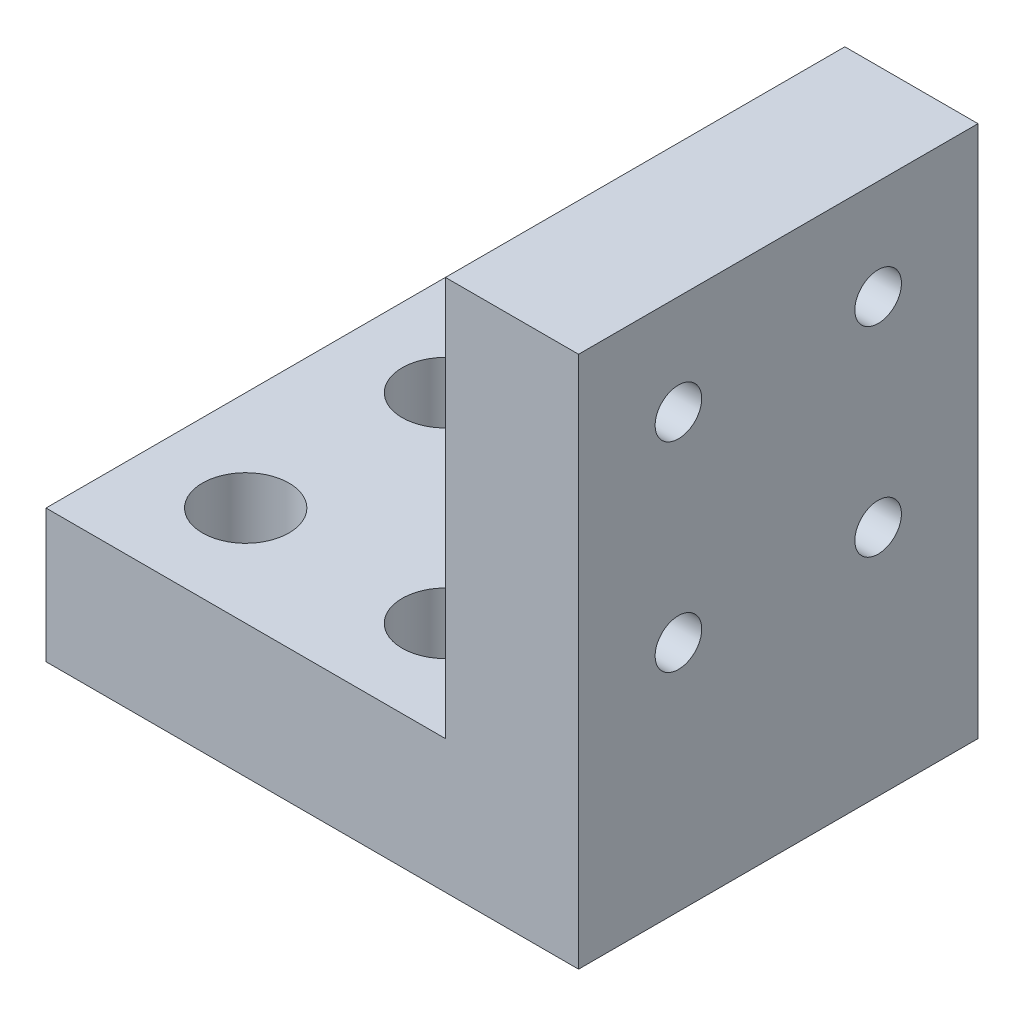
ISO-10303-21;
HEADER;
FILE_DESCRIPTION(('STEP AP214'),'2;1');
FILE_NAME('part.step','',(''),(''),'','','');
FILE_SCHEMA(('AUTOMOTIVE_DESIGN { 1 0 10303 214 1 1 1 1 }'));
ENDSEC;
DATA;
#1=APPLICATION_CONTEXT('core data for automotive mechanical design processes');
#2=APPLICATION_PROTOCOL_DEFINITION('international standard','automotive_design',2000,#1);
#3=PRODUCT_CONTEXT('',#1,'mechanical');
#4=PRODUCT('Part','Part','',(#3));
#5=PRODUCT_RELATED_PRODUCT_CATEGORY('part','',(#4));
#6=PRODUCT_DEFINITION_FORMATION('','',#4);
#7=PRODUCT_DEFINITION_CONTEXT('part definition',#1,'design');
#8=PRODUCT_DEFINITION('design','',#6,#7);
#9=PRODUCT_DEFINITION_SHAPE('','',#8);
#10=(LENGTH_UNIT() NAMED_UNIT(*) SI_UNIT(.MILLI.,.METRE.));
#11=(NAMED_UNIT(*) PLANE_ANGLE_UNIT() SI_UNIT($,.RADIAN.));
#12=(NAMED_UNIT(*) SI_UNIT($,.STERADIAN.) SOLID_ANGLE_UNIT());
#13=UNCERTAINTY_MEASURE_WITH_UNIT(LENGTH_MEASURE(1.E-05),#10,'distance_accuracy_value','');
#14=(GEOMETRIC_REPRESENTATION_CONTEXT(3) GLOBAL_UNCERTAINTY_ASSIGNED_CONTEXT((#13)) GLOBAL_UNIT_ASSIGNED_CONTEXT((#10,
#11,#12)) REPRESENTATION_CONTEXT('',''));
#15=CARTESIAN_POINT('',(0.,0.,0.));
#16=DIRECTION('',(0.,0.,1.));
#17=DIRECTION('',(1.,0.,0.));
#18=AXIS2_PLACEMENT_3D('',#15,#16,#17);
#19=CARTESIAN_POINT('',(0.,10.,0.));
#20=DIRECTION('',(0.,-1.,0.));
#21=DIRECTION('',(0.,0.,-1.));
#22=AXIS2_PLACEMENT_3D('',#19,#20,#21);
#23=PLANE('',#22);
#24=CARTESIAN_POINT('',(7.50000000000016,10.,-7.5));
#25=DIRECTION('',(0.,1.,0.));
#26=DIRECTION('',(0.,0.,1.));
#27=AXIS2_PLACEMENT_3D('',#24,#25,#26);
#28=CIRCLE('',#27,3.25);
#29=CARTESIAN_POINT('',(7.50000000000016,10.,-4.25));
#30=VERTEX_POINT('',#29);
#31=EDGE_CURVE('E141',#30,#30,#28,.T.);
#32=ORIENTED_EDGE('',*,*,#31,.F.);
#33=EDGE_LOOP('',(#32));
#34=FACE_BOUND('',#33,.T.);
#35=CARTESIAN_POINT('',(22.5000000000002,10.,-7.5));
#36=DIRECTION('',(0.,1.,0.));
#37=DIRECTION('',(0.,0.,1.));
#38=AXIS2_PLACEMENT_3D('',#35,#36,#37);
#39=CIRCLE('',#38,3.25);
#40=CARTESIAN_POINT('',(22.5000000000002,10.,-4.25));
#41=VERTEX_POINT('',#40);
#42=EDGE_CURVE('E209',#41,#41,#39,.T.);
#43=ORIENTED_EDGE('',*,*,#42,.F.);
#44=EDGE_LOOP('',(#43));
#45=FACE_BOUND('',#44,.T.);
#46=CARTESIAN_POINT('',(22.5,10.,-22.5));
#47=DIRECTION('',(0.,1.,0.));
#48=DIRECTION('',(0.,0.,1.));
#49=AXIS2_PLACEMENT_3D('',#46,#47,#48);
#50=CIRCLE('',#49,3.25);
#51=CARTESIAN_POINT('',(22.5,10.,-19.25));
#52=VERTEX_POINT('',#51);
#53=EDGE_CURVE('E201',#52,#52,#50,.T.);
#54=ORIENTED_EDGE('',*,*,#53,.F.);
#55=EDGE_LOOP('',(#54));
#56=FACE_BOUND('',#55,.T.);
#57=CARTESIAN_POINT('',(7.5,10.,-22.5));
#58=DIRECTION('',(0.,1.,0.));
#59=DIRECTION('',(0.,0.,1.));
#60=AXIS2_PLACEMENT_3D('',#57,#58,#59);
#61=CIRCLE('',#60,3.25);
#62=CARTESIAN_POINT('',(7.5,10.,-19.25));
#63=VERTEX_POINT('',#62);
#64=EDGE_CURVE('E200',#63,#63,#61,.T.);
#65=ORIENTED_EDGE('',*,*,#64,.F.);
#66=EDGE_LOOP('',(#65));
#67=FACE_BOUND('',#66,.T.);
#68=DIRECTION('',(0.,0.,1.));
#69=VECTOR('',#68,1.);
#70=CARTESIAN_POINT('',(30.,10.,-30.));
#71=LINE('',#70,#69);
#72=CARTESIAN_POINT('',(30.,10.,-30.));
#73=VERTEX_POINT('',#72);
#74=CARTESIAN_POINT('',(30.,10.,0.));
#75=VERTEX_POINT('',#74);
#76=EDGE_CURVE('E57',#73,#75,#71,.T.);
#77=ORIENTED_EDGE('',*,*,#76,.F.);
#78=DIRECTION('',(-1.,0.,0.));
#79=VECTOR('',#78,1.);
#80=CARTESIAN_POINT('',(0.,10.,-30.));
#81=LINE('',#80,#79);
#82=CARTESIAN_POINT('',(0.,10.,-30.));
#83=VERTEX_POINT('',#82);
#84=EDGE_CURVE('E62',#73,#83,#81,.T.);
#85=ORIENTED_EDGE('',*,*,#84,.T.);
#86=DIRECTION('',(0.,0.,1.));
#87=VECTOR('',#86,1.);
#88=CARTESIAN_POINT('',(0.,10.,0.));
#89=LINE('',#88,#87);
#90=CARTESIAN_POINT('',(0.,10.,0.));
#91=VERTEX_POINT('',#90);
#92=EDGE_CURVE('E94',#83,#91,#89,.T.);
#93=ORIENTED_EDGE('',*,*,#92,.T.);
#94=DIRECTION('',(1.,0.,0.));
#95=VECTOR('',#94,1.);
#96=CARTESIAN_POINT('',(0.,10.,0.));
#97=LINE('',#96,#95);
#98=EDGE_CURVE('E249',#91,#75,#97,.T.);
#99=ORIENTED_EDGE('',*,*,#98,.T.);
#100=EDGE_LOOP('',(#77,#85,#93,#99));
#101=FACE_BOUND('',#100,.T.);
#102=ADVANCED_FACE('F39',(#34,#45,#56,#67,#101),#23,.F.);
#103=CARTESIAN_POINT('',(0.,10.,0.));
#104=DIRECTION('',(1.,0.,0.));
#105=DIRECTION('',(0.,0.,-1.));
#106=AXIS2_PLACEMENT_3D('',#103,#104,#105);
#107=PLANE('',#106);
#108=DIRECTION('',(0.,0.,1.));
#109=VECTOR('',#108,1.);
#110=CARTESIAN_POINT('',(0.,0.,0.));
#111=LINE('',#110,#109);
#112=CARTESIAN_POINT('',(0.,0.,-30.));
#113=VERTEX_POINT('',#112);
#114=CARTESIAN_POINT('',(0.,0.,0.));
#115=VERTEX_POINT('',#114);
#116=EDGE_CURVE('E100',#113,#115,#111,.T.);
#117=ORIENTED_EDGE('',*,*,#116,.T.);
#118=DIRECTION('',(0.,-1.,0.));
#119=VECTOR('',#118,1.);
#120=CARTESIAN_POINT('',(0.,10.,0.));
#121=LINE('',#120,#119);
#122=EDGE_CURVE('E11',#91,#115,#121,.T.);
#123=ORIENTED_EDGE('',*,*,#122,.F.);
#124=ORIENTED_EDGE('',*,*,#92,.F.);
#125=DIRECTION('',(0.,-1.,0.));
#126=VECTOR('',#125,1.);
#127=CARTESIAN_POINT('',(0.,10.,-30.));
#128=LINE('',#127,#126);
#129=EDGE_CURVE('E85',#83,#113,#128,.T.);
#130=ORIENTED_EDGE('',*,*,#129,.T.);
#131=EDGE_LOOP('',(#117,#123,#124,#130));
#132=FACE_BOUND('',#131,.T.);
#133=ADVANCED_FACE('F41',(#132),#107,.F.);
#134=CARTESIAN_POINT('',(0.,10.,0.));
#135=DIRECTION('',(0.,0.,-1.));
#136=DIRECTION('',(-1.,0.,0.));
#137=AXIS2_PLACEMENT_3D('',#134,#135,#136);
#138=PLANE('',#137);
#139=DIRECTION('',(1.,0.,0.));
#140=VECTOR('',#139,1.);
#141=CARTESIAN_POINT('',(0.,0.,0.));
#142=LINE('',#141,#140);
#143=CARTESIAN_POINT('',(40.,0.,0.));
#144=VERTEX_POINT('',#143);
#145=EDGE_CURVE('E104',#115,#144,#142,.T.);
#146=ORIENTED_EDGE('',*,*,#145,.T.);
#147=DIRECTION('',(0.,-1.,0.));
#148=VECTOR('',#147,1.);
#149=CARTESIAN_POINT('',(40.,10.,0.));
#150=LINE('',#149,#148);
#151=CARTESIAN_POINT('',(40.,40.,0.));
#152=VERTEX_POINT('',#151);
#153=EDGE_CURVE('E49',#152,#144,#150,.T.);
#154=ORIENTED_EDGE('',*,*,#153,.F.);
#155=DIRECTION('',(1.,0.,0.));
#156=VECTOR('',#155,1.);
#157=CARTESIAN_POINT('',(40.,40.,0.));
#158=LINE('',#157,#156);
#159=CARTESIAN_POINT('',(30.,40.,0.));
#160=VERTEX_POINT('',#159);
#161=EDGE_CURVE('E239',#160,#152,#158,.T.);
#162=ORIENTED_EDGE('',*,*,#161,.F.);
#163=DIRECTION('',(0.,-1.,0.));
#164=VECTOR('',#163,1.);
#165=CARTESIAN_POINT('',(30.,40.,0.));
#166=LINE('',#165,#164);
#167=EDGE_CURVE('E112',#160,#75,#166,.T.);
#168=ORIENTED_EDGE('',*,*,#167,.T.);
#169=ORIENTED_EDGE('',*,*,#98,.F.);
#170=ORIENTED_EDGE('',*,*,#122,.T.);
#171=EDGE_LOOP('',(#146,#154,#162,#168,#169,#170));
#172=FACE_BOUND('',#171,.T.);
#173=ADVANCED_FACE('F262',(#172),#138,.F.);
#174=CARTESIAN_POINT('',(40.,10.,0.));
#175=DIRECTION('',(-1.,0.,0.));
#176=DIRECTION('',(0.,0.,1.));
#177=AXIS2_PLACEMENT_3D('',#174,#175,#176);
#178=PLANE('',#177);
#179=CARTESIAN_POINT('',(40.,17.4999999999999,-22.4999999999998));
#180=DIRECTION('',(-1.,0.,0.));
#181=DIRECTION('',(0.,0.,1.));
#182=AXIS2_PLACEMENT_3D('',#179,#180,#181);
#183=CIRCLE('',#182,1.75);
#184=CARTESIAN_POINT('',(40.,17.4999999999999,-20.7499999999998));
#185=VERTEX_POINT('',#184);
#186=EDGE_CURVE('E559',#185,#185,#183,.F.);
#187=ORIENTED_EDGE('',*,*,#186,.F.);
#188=EDGE_LOOP('',(#187));
#189=FACE_BOUND('',#188,.T.);
#190=CARTESIAN_POINT('',(40.,17.4999999999999,-7.49999999999984));
#191=DIRECTION('',(-1.,0.,0.));
#192=DIRECTION('',(0.,0.,1.));
#193=AXIS2_PLACEMENT_3D('',#190,#191,#192);
#194=CIRCLE('',#193,1.75);
#195=CARTESIAN_POINT('',(40.,17.4999999999999,-5.74999999999984));
#196=VERTEX_POINT('',#195);
#197=EDGE_CURVE('E552',#196,#196,#194,.F.);
#198=ORIENTED_EDGE('',*,*,#197,.F.);
#199=EDGE_LOOP('',(#198));
#200=FACE_BOUND('',#199,.T.);
#201=CARTESIAN_POINT('',(40.,32.4999999999999,-7.5));
#202=DIRECTION('',(-1.,0.,0.));
#203=DIRECTION('',(0.,0.,1.));
#204=AXIS2_PLACEMENT_3D('',#201,#202,#203);
#205=CIRCLE('',#204,1.75);
#206=CARTESIAN_POINT('',(40.,32.4999999999999,-5.75));
#207=VERTEX_POINT('',#206);
#208=EDGE_CURVE('E549',#207,#207,#205,.F.);
#209=ORIENTED_EDGE('',*,*,#208,.F.);
#210=EDGE_LOOP('',(#209));
#211=FACE_BOUND('',#210,.T.);
#212=CARTESIAN_POINT('',(40.,32.4999999999999,-22.5));
#213=DIRECTION('',(-1.,0.,0.));
#214=DIRECTION('',(0.,0.,1.));
#215=AXIS2_PLACEMENT_3D('',#212,#213,#214);
#216=CIRCLE('',#215,1.75);
#217=CARTESIAN_POINT('',(40.,32.4999999999999,-20.75));
#218=VERTEX_POINT('',#217);
#219=EDGE_CURVE('E147',#218,#218,#216,.F.);
#220=ORIENTED_EDGE('',*,*,#219,.F.);
#221=EDGE_LOOP('',(#220));
#222=FACE_BOUND('',#221,.T.);
#223=DIRECTION('',(0.,0.,-1.));
#224=VECTOR('',#223,1.);
#225=CARTESIAN_POINT('',(40.,0.,0.));
#226=LINE('',#225,#224);
#227=CARTESIAN_POINT('',(40.,0.,-30.));
#228=VERTEX_POINT('',#227);
#229=EDGE_CURVE('E95',#144,#228,#226,.T.);
#230=ORIENTED_EDGE('',*,*,#229,.T.);
#231=DIRECTION('',(0.,-1.,0.));
#232=VECTOR('',#231,1.);
#233=CARTESIAN_POINT('',(40.,10.,-30.));
#234=LINE('',#233,#232);
#235=CARTESIAN_POINT('',(40.,40.,-30.));
#236=VERTEX_POINT('',#235);
#237=EDGE_CURVE('E89',#236,#228,#234,.T.);
#238=ORIENTED_EDGE('',*,*,#237,.F.);
#239=DIRECTION('',(0.,0.,-1.));
#240=VECTOR('',#239,1.);
#241=CARTESIAN_POINT('',(40.,40.,-30.));
#242=LINE('',#241,#240);
#243=EDGE_CURVE('E227',#152,#236,#242,.T.);
#244=ORIENTED_EDGE('',*,*,#243,.F.);
#245=ORIENTED_EDGE('',*,*,#153,.T.);
#246=EDGE_LOOP('',(#230,#238,#244,#245));
#247=FACE_BOUND('',#246,.T.);
#248=ADVANCED_FACE('F271',(#189,#200,#211,#222,#247),#178,.F.);
#249=CARTESIAN_POINT('',(0.,10.,-30.));
#250=DIRECTION('',(0.,0.,1.));
#251=DIRECTION('',(1.,0.,0.));
#252=AXIS2_PLACEMENT_3D('',#249,#250,#251);
#253=PLANE('',#252);
#254=DIRECTION('',(-1.,0.,0.));
#255=VECTOR('',#254,1.);
#256=CARTESIAN_POINT('',(0.,0.,-30.));
#257=LINE('',#256,#255);
#258=EDGE_CURVE('E82',#228,#113,#257,.T.);
#259=ORIENTED_EDGE('',*,*,#258,.T.);
#260=ORIENTED_EDGE('',*,*,#129,.F.);
#261=ORIENTED_EDGE('',*,*,#84,.F.);
#262=DIRECTION('',(0.,-1.,0.));
#263=VECTOR('',#262,1.);
#264=CARTESIAN_POINT('',(30.,40.,-30.));
#265=LINE('',#264,#263);
#266=CARTESIAN_POINT('',(30.,40.,-30.));
#267=VERTEX_POINT('',#266);
#268=EDGE_CURVE('E106',#267,#73,#265,.T.);
#269=ORIENTED_EDGE('',*,*,#268,.F.);
#270=DIRECTION('',(-1.,0.,0.));
#271=VECTOR('',#270,1.);
#272=CARTESIAN_POINT('',(40.,40.,-30.));
#273=LINE('',#272,#271);
#274=EDGE_CURVE('E231',#236,#267,#273,.T.);
#275=ORIENTED_EDGE('',*,*,#274,.F.);
#276=ORIENTED_EDGE('',*,*,#237,.T.);
#277=EDGE_LOOP('',(#259,#260,#261,#269,#275,#276));
#278=FACE_BOUND('',#277,.T.);
#279=ADVANCED_FACE('F84',(#278),#253,.F.);
#280=CARTESIAN_POINT('',(0.,0.,0.));
#281=DIRECTION('',(0.,-1.,0.));
#282=DIRECTION('',(0.,0.,-1.));
#283=AXIS2_PLACEMENT_3D('',#280,#281,#282);
#284=PLANE('',#283);
#285=CARTESIAN_POINT('',(7.50000000000016,0.,-7.5));
#286=DIRECTION('',(0.,-1.,0.));
#287=DIRECTION('',(0.,0.,-1.));
#288=AXIS2_PLACEMENT_3D('',#285,#286,#287);
#289=CIRCLE('',#288,1.75);
#290=CARTESIAN_POINT('',(7.50000000000016,0.,-9.25));
#291=VERTEX_POINT('',#290);
#292=EDGE_CURVE('E176',#291,#291,#289,.F.);
#293=ORIENTED_EDGE('',*,*,#292,.T.);
#294=EDGE_LOOP('',(#293));
#295=FACE_BOUND('',#294,.T.);
#296=CARTESIAN_POINT('',(22.5000000000002,0.,-7.5));
#297=DIRECTION('',(0.,-1.,0.));
#298=DIRECTION('',(0.,0.,-1.));
#299=AXIS2_PLACEMENT_3D('',#296,#297,#298);
#300=CIRCLE('',#299,1.75);
#301=CARTESIAN_POINT('',(22.5000000000002,0.,-9.25));
#302=VERTEX_POINT('',#301);
#303=EDGE_CURVE('E186',#302,#302,#300,.F.);
#304=ORIENTED_EDGE('',*,*,#303,.T.);
#305=EDGE_LOOP('',(#304));
#306=FACE_BOUND('',#305,.T.);
#307=CARTESIAN_POINT('',(22.5,0.,-22.5));
#308=DIRECTION('',(0.,-1.,0.));
#309=DIRECTION('',(0.,0.,-1.));
#310=AXIS2_PLACEMENT_3D('',#307,#308,#309);
#311=CIRCLE('',#310,1.75);
#312=CARTESIAN_POINT('',(22.5,0.,-24.25));
#313=VERTEX_POINT('',#312);
#314=EDGE_CURVE('E182',#313,#313,#311,.F.);
#315=ORIENTED_EDGE('',*,*,#314,.T.);
#316=EDGE_LOOP('',(#315));
#317=FACE_BOUND('',#316,.T.);
#318=CARTESIAN_POINT('',(7.5,0.,-22.5));
#319=DIRECTION('',(0.,-1.,0.));
#320=DIRECTION('',(0.,0.,-1.));
#321=AXIS2_PLACEMENT_3D('',#318,#319,#320);
#322=CIRCLE('',#321,1.75);
#323=CARTESIAN_POINT('',(7.5,0.,-24.25));
#324=VERTEX_POINT('',#323);
#325=EDGE_CURVE('E129',#324,#324,#322,.F.);
#326=ORIENTED_EDGE('',*,*,#325,.T.);
#327=EDGE_LOOP('',(#326));
#328=FACE_BOUND('',#327,.T.);
#329=ORIENTED_EDGE('',*,*,#116,.F.);
#330=ORIENTED_EDGE('',*,*,#258,.F.);
#331=ORIENTED_EDGE('',*,*,#229,.F.);
#332=ORIENTED_EDGE('',*,*,#145,.F.);
#333=EDGE_LOOP('',(#329,#330,#331,#332));
#334=FACE_BOUND('',#333,.T.);
#335=ADVANCED_FACE('F103',(#295,#306,#317,#328,#334),#284,.T.);
#336=CARTESIAN_POINT('',(30.,40.,-30.));
#337=DIRECTION('',(1.,0.,0.));
#338=DIRECTION('',(0.,0.,-1.));
#339=AXIS2_PLACEMENT_3D('',#336,#337,#338);
#340=PLANE('',#339);
#341=CARTESIAN_POINT('',(30.,17.5,-7.49999999999984));
#342=DIRECTION('',(-1.,0.,0.));
#343=DIRECTION('',(0.,0.,1.));
#344=AXIS2_PLACEMENT_3D('',#341,#342,#343);
#345=CIRCLE('',#344,3.25);
#346=CARTESIAN_POINT('',(30.,17.5,-4.24999999999984));
#347=VERTEX_POINT('',#346);
#348=EDGE_CURVE('E157',#347,#347,#345,.T.);
#349=ORIENTED_EDGE('',*,*,#348,.F.);
#350=EDGE_LOOP('',(#349));
#351=FACE_BOUND('',#350,.T.);
#352=CARTESIAN_POINT('',(30.,17.4999999999999,-22.4999999999998));
#353=DIRECTION('',(-1.,0.,0.));
#354=DIRECTION('',(0.,0.,1.));
#355=AXIS2_PLACEMENT_3D('',#352,#353,#354);
#356=CIRCLE('',#355,3.25);
#357=CARTESIAN_POINT('',(30.,17.4999999999999,-19.2499999999998));
#358=VERTEX_POINT('',#357);
#359=EDGE_CURVE('E168',#358,#358,#356,.T.);
#360=ORIENTED_EDGE('',*,*,#359,.F.);
#361=EDGE_LOOP('',(#360));
#362=FACE_BOUND('',#361,.T.);
#363=CARTESIAN_POINT('',(30.,32.4999999999999,-22.5));
#364=DIRECTION('',(-1.,0.,0.));
#365=DIRECTION('',(0.,0.,1.));
#366=AXIS2_PLACEMENT_3D('',#363,#364,#365);
#367=CIRCLE('',#366,3.25);
#368=CARTESIAN_POINT('',(30.,32.4999999999999,-19.25));
#369=VERTEX_POINT('',#368);
#370=EDGE_CURVE('E568',#369,#369,#367,.T.);
#371=ORIENTED_EDGE('',*,*,#370,.F.);
#372=EDGE_LOOP('',(#371));
#373=FACE_BOUND('',#372,.T.);
#374=CARTESIAN_POINT('',(30.,32.5,-7.5));
#375=DIRECTION('',(-1.,0.,0.));
#376=DIRECTION('',(0.,0.,1.));
#377=AXIS2_PLACEMENT_3D('',#374,#375,#376);
#378=CIRCLE('',#377,3.25);
#379=CARTESIAN_POINT('',(30.,32.5,-4.25));
#380=VERTEX_POINT('',#379);
#381=EDGE_CURVE('E177',#380,#380,#378,.T.);
#382=ORIENTED_EDGE('',*,*,#381,.F.);
#383=EDGE_LOOP('',(#382));
#384=FACE_BOUND('',#383,.T.);
#385=ORIENTED_EDGE('',*,*,#76,.T.);
#386=ORIENTED_EDGE('',*,*,#167,.F.);
#387=DIRECTION('',(0.,0.,1.));
#388=VECTOR('',#387,1.);
#389=CARTESIAN_POINT('',(30.,40.,-30.));
#390=LINE('',#389,#388);
#391=EDGE_CURVE('E235',#267,#160,#390,.T.);
#392=ORIENTED_EDGE('',*,*,#391,.F.);
#393=ORIENTED_EDGE('',*,*,#268,.T.);
#394=EDGE_LOOP('',(#385,#386,#392,#393));
#395=FACE_BOUND('',#394,.T.);
#396=ADVANCED_FACE('F257',(#351,#362,#373,#384,#395),#340,.F.);
#397=CARTESIAN_POINT('',(0.,40.,0.));
#398=DIRECTION('',(0.,-1.,0.));
#399=DIRECTION('',(0.,0.,-1.));
#400=AXIS2_PLACEMENT_3D('',#397,#398,#399);
#401=PLANE('',#400);
#402=ORIENTED_EDGE('',*,*,#243,.T.);
#403=ORIENTED_EDGE('',*,*,#274,.T.);
#404=ORIENTED_EDGE('',*,*,#391,.T.);
#405=ORIENTED_EDGE('',*,*,#161,.T.);
#406=EDGE_LOOP('',(#402,#403,#404,#405));
#407=FACE_BOUND('',#406,.T.);
#408=ADVANCED_FACE('F268',(#407),#401,.F.);
#409=CARTESIAN_POINT('',(7.5,4.,-22.5));
#410=DIRECTION('',(0.,1.,0.));
#411=DIRECTION('',(0.,0.,1.));
#412=AXIS2_PLACEMENT_3D('',#409,#410,#411);
#413=CYLINDRICAL_SURFACE('',#412,3.25);
#414=CARTESIAN_POINT('',(7.5,4.,-22.5));
#415=DIRECTION('',(0.,1.,0.));
#416=DIRECTION('',(0.,0.,1.));
#417=AXIS2_PLACEMENT_3D('',#414,#415,#416);
#418=CIRCLE('',#417,3.25);
#419=CARTESIAN_POINT('',(7.5,4.,-19.25));
#420=VERTEX_POINT('',#419);
#421=EDGE_CURVE('E220',#420,#420,#418,.T.);
#422=ORIENTED_EDGE('',*,*,#421,.F.);
#423=EDGE_LOOP('',(#422));
#424=FACE_BOUND('',#423,.T.);
#425=ORIENTED_EDGE('',*,*,#64,.T.);
#426=EDGE_LOOP('',(#425));
#427=FACE_BOUND('',#426,.T.);
#428=ADVANCED_FACE('F356',(#424,#427),#413,.F.);
#429=CARTESIAN_POINT('',(7.5,4.,-22.5));
#430=DIRECTION('',(0.,1.,0.));
#431=DIRECTION('',(0.,0.,1.));
#432=AXIS2_PLACEMENT_3D('',#429,#430,#431);
#433=PLANE('',#432);
#434=CARTESIAN_POINT('',(7.5,4.,-22.5));
#435=DIRECTION('',(0.,1.,0.));
#436=DIRECTION('',(0.,0.,1.));
#437=AXIS2_PLACEMENT_3D('',#434,#435,#436);
#438=CIRCLE('',#437,1.75);
#439=CARTESIAN_POINT('',(7.5,4.,-20.75));
#440=VERTEX_POINT('',#439);
#441=EDGE_CURVE('E137',#440,#440,#438,.T.);
#442=ORIENTED_EDGE('',*,*,#441,.F.);
#443=EDGE_LOOP('',(#442));
#444=FACE_BOUND('',#443,.T.);
#445=ORIENTED_EDGE('',*,*,#421,.T.);
#446=EDGE_LOOP('',(#445));
#447=FACE_BOUND('',#446,.T.);
#448=ADVANCED_FACE('F337',(#444,#447),#433,.T.);
#449=CARTESIAN_POINT('',(22.5,4.,-22.5));
#450=DIRECTION('',(0.,1.,0.));
#451=DIRECTION('',(0.,0.,1.));
#452=AXIS2_PLACEMENT_3D('',#449,#450,#451);
#453=CYLINDRICAL_SURFACE('',#452,3.25);
#454=CARTESIAN_POINT('',(22.5,4.,-22.5));
#455=DIRECTION('',(0.,1.,0.));
#456=DIRECTION('',(0.,0.,1.));
#457=AXIS2_PLACEMENT_3D('',#454,#455,#456);
#458=CIRCLE('',#457,3.25);
#459=CARTESIAN_POINT('',(22.5,4.,-19.25));
#460=VERTEX_POINT('',#459);
#461=EDGE_CURVE('E196',#460,#460,#458,.T.);
#462=ORIENTED_EDGE('',*,*,#461,.F.);
#463=EDGE_LOOP('',(#462));
#464=FACE_BOUND('',#463,.T.);
#465=ORIENTED_EDGE('',*,*,#53,.T.);
#466=EDGE_LOOP('',(#465));
#467=FACE_BOUND('',#466,.T.);
#468=ADVANCED_FACE('F333',(#464,#467),#453,.F.);
#469=CARTESIAN_POINT('',(22.5,4.,-22.5));
#470=DIRECTION('',(0.,1.,0.));
#471=DIRECTION('',(0.,0.,1.));
#472=AXIS2_PLACEMENT_3D('',#469,#470,#471);
#473=PLANE('',#472);
#474=CARTESIAN_POINT('',(22.5,4.,-22.5));
#475=DIRECTION('',(0.,1.,0.));
#476=DIRECTION('',(0.,0.,1.));
#477=AXIS2_PLACEMENT_3D('',#474,#475,#476);
#478=CIRCLE('',#477,1.75);
#479=CARTESIAN_POINT('',(22.5,4.,-20.75));
#480=VERTEX_POINT('',#479);
#481=EDGE_CURVE('E133',#480,#480,#478,.T.);
#482=ORIENTED_EDGE('',*,*,#481,.F.);
#483=EDGE_LOOP('',(#482));
#484=FACE_BOUND('',#483,.T.);
#485=ORIENTED_EDGE('',*,*,#461,.T.);
#486=EDGE_LOOP('',(#485));
#487=FACE_BOUND('',#486,.T.);
#488=ADVANCED_FACE('F329',(#484,#487),#473,.T.);
#489=CARTESIAN_POINT('',(22.5000000000002,4.,-7.5));
#490=DIRECTION('',(0.,1.,0.));
#491=DIRECTION('',(0.,0.,1.));
#492=AXIS2_PLACEMENT_3D('',#489,#490,#491);
#493=CYLINDRICAL_SURFACE('',#492,3.25);
#494=CARTESIAN_POINT('',(22.5000000000002,4.,-7.5));
#495=DIRECTION('',(0.,1.,0.));
#496=DIRECTION('',(0.,0.,1.));
#497=AXIS2_PLACEMENT_3D('',#494,#495,#496);
#498=CIRCLE('',#497,3.25);
#499=CARTESIAN_POINT('',(22.5000000000002,4.,-4.25));
#500=VERTEX_POINT('',#499);
#501=EDGE_CURVE('E205',#500,#500,#498,.T.);
#502=ORIENTED_EDGE('',*,*,#501,.F.);
#503=EDGE_LOOP('',(#502));
#504=FACE_BOUND('',#503,.T.);
#505=ORIENTED_EDGE('',*,*,#42,.T.);
#506=EDGE_LOOP('',(#505));
#507=FACE_BOUND('',#506,.T.);
#508=ADVANCED_FACE('F332',(#504,#507),#493,.F.);
#509=CARTESIAN_POINT('',(22.5000000000002,4.,-7.5));
#510=DIRECTION('',(0.,1.,0.));
#511=DIRECTION('',(0.,0.,1.));
#512=AXIS2_PLACEMENT_3D('',#509,#510,#511);
#513=PLANE('',#512);
#514=CARTESIAN_POINT('',(22.5000000000002,4.,-7.5));
#515=DIRECTION('',(0.,1.,0.));
#516=DIRECTION('',(0.,0.,1.));
#517=AXIS2_PLACEMENT_3D('',#514,#515,#516);
#518=CIRCLE('',#517,1.75);
#519=CARTESIAN_POINT('',(22.5000000000002,4.,-5.75));
#520=VERTEX_POINT('',#519);
#521=EDGE_CURVE('E128',#520,#520,#518,.T.);
#522=ORIENTED_EDGE('',*,*,#521,.F.);
#523=EDGE_LOOP('',(#522));
#524=FACE_BOUND('',#523,.T.);
#525=ORIENTED_EDGE('',*,*,#501,.T.);
#526=EDGE_LOOP('',(#525));
#527=FACE_BOUND('',#526,.T.);
#528=ADVANCED_FACE('F339',(#524,#527),#513,.T.);
#529=CARTESIAN_POINT('',(7.50000000000016,4.,-7.5));
#530=DIRECTION('',(0.,1.,0.));
#531=DIRECTION('',(0.,0.,1.));
#532=AXIS2_PLACEMENT_3D('',#529,#530,#531);
#533=CYLINDRICAL_SURFACE('',#532,3.25);
#534=CARTESIAN_POINT('',(7.50000000000016,4.,-7.5));
#535=DIRECTION('',(0.,1.,0.));
#536=DIRECTION('',(0.,0.,1.));
#537=AXIS2_PLACEMENT_3D('',#534,#535,#536);
#538=CIRCLE('',#537,3.25);
#539=CARTESIAN_POINT('',(7.50000000000016,4.,-4.25));
#540=VERTEX_POINT('',#539);
#541=EDGE_CURVE('E213',#540,#540,#538,.T.);
#542=ORIENTED_EDGE('',*,*,#541,.F.);
#543=EDGE_LOOP('',(#542));
#544=FACE_BOUND('',#543,.T.);
#545=ORIENTED_EDGE('',*,*,#31,.T.);
#546=EDGE_LOOP('',(#545));
#547=FACE_BOUND('',#546,.T.);
#548=ADVANCED_FACE('F342',(#544,#547),#533,.F.);
#549=CARTESIAN_POINT('',(7.50000000000016,4.,-7.5));
#550=DIRECTION('',(0.,1.,0.));
#551=DIRECTION('',(0.,0.,1.));
#552=AXIS2_PLACEMENT_3D('',#549,#550,#551);
#553=PLANE('',#552);
#554=CARTESIAN_POINT('',(7.50000000000016,4.,-7.5));
#555=DIRECTION('',(0.,1.,0.));
#556=DIRECTION('',(0.,0.,1.));
#557=AXIS2_PLACEMENT_3D('',#554,#555,#556);
#558=CIRCLE('',#557,1.75);
#559=CARTESIAN_POINT('',(7.50000000000016,4.,-5.75));
#560=VERTEX_POINT('',#559);
#561=EDGE_CURVE('E124',#560,#560,#558,.T.);
#562=ORIENTED_EDGE('',*,*,#561,.F.);
#563=EDGE_LOOP('',(#562));
#564=FACE_BOUND('',#563,.T.);
#565=ORIENTED_EDGE('',*,*,#541,.T.);
#566=EDGE_LOOP('',(#565));
#567=FACE_BOUND('',#566,.T.);
#568=ADVANCED_FACE('F347',(#564,#567),#553,.T.);
#569=CARTESIAN_POINT('',(7.50000000000016,-4.94974746830585,-7.5));
#570=DIRECTION('',(0.,1.,0.));
#571=DIRECTION('',(0.,0.,1.));
#572=AXIS2_PLACEMENT_3D('',#569,#570,#571);
#573=CYLINDRICAL_SURFACE('',#572,1.75);
#574=ORIENTED_EDGE('',*,*,#561,.T.);
#575=EDGE_LOOP('',(#574));
#576=FACE_BOUND('',#575,.T.);
#577=ORIENTED_EDGE('',*,*,#292,.F.);
#578=EDGE_LOOP('',(#577));
#579=FACE_BOUND('',#578,.T.);
#580=ADVANCED_FACE('F327',(#576,#579),#573,.F.);
#581=CARTESIAN_POINT('',(22.5000000000002,-4.94974746830585,-7.5));
#582=DIRECTION('',(0.,1.,0.));
#583=DIRECTION('',(0.,0.,1.));
#584=AXIS2_PLACEMENT_3D('',#581,#582,#583);
#585=CYLINDRICAL_SURFACE('',#584,1.75);
#586=ORIENTED_EDGE('',*,*,#521,.T.);
#587=EDGE_LOOP('',(#586));
#588=FACE_BOUND('',#587,.T.);
#589=ORIENTED_EDGE('',*,*,#303,.F.);
#590=EDGE_LOOP('',(#589));
#591=FACE_BOUND('',#590,.T.);
#592=ADVANCED_FACE('F322',(#588,#591),#585,.F.);
#593=CARTESIAN_POINT('',(22.5,-4.94974746830585,-22.5));
#594=DIRECTION('',(0.,1.,0.));
#595=DIRECTION('',(0.,0.,1.));
#596=AXIS2_PLACEMENT_3D('',#593,#594,#595);
#597=CYLINDRICAL_SURFACE('',#596,1.75);
#598=ORIENTED_EDGE('',*,*,#481,.T.);
#599=EDGE_LOOP('',(#598));
#600=FACE_BOUND('',#599,.T.);
#601=ORIENTED_EDGE('',*,*,#314,.F.);
#602=EDGE_LOOP('',(#601));
#603=FACE_BOUND('',#602,.T.);
#604=ADVANCED_FACE('F312',(#600,#603),#597,.F.);
#605=CARTESIAN_POINT('',(7.5,-4.94974746830585,-22.5));
#606=DIRECTION('',(0.,1.,0.));
#607=DIRECTION('',(0.,0.,1.));
#608=AXIS2_PLACEMENT_3D('',#605,#606,#607);
#609=CYLINDRICAL_SURFACE('',#608,1.75);
#610=ORIENTED_EDGE('',*,*,#441,.T.);
#611=EDGE_LOOP('',(#610));
#612=FACE_BOUND('',#611,.T.);
#613=ORIENTED_EDGE('',*,*,#325,.F.);
#614=EDGE_LOOP('',(#613));
#615=FACE_BOUND('',#614,.T.);
#616=ADVANCED_FACE('F309',(#612,#615),#609,.F.);
#617=CARTESIAN_POINT('',(36.,32.5,-7.5));
#618=DIRECTION('',(-1.,0.,0.));
#619=DIRECTION('',(0.,0.,1.));
#620=AXIS2_PLACEMENT_3D('',#617,#618,#619);
#621=CYLINDRICAL_SURFACE('',#620,3.25);
#622=CARTESIAN_POINT('',(36.,32.5,-7.5));
#623=DIRECTION('',(-1.,0.,0.));
#624=DIRECTION('',(0.,0.,1.));
#625=AXIS2_PLACEMENT_3D('',#622,#623,#624);
#626=CIRCLE('',#625,3.25);
#627=CARTESIAN_POINT('',(36.,32.5,-4.25));
#628=VERTEX_POINT('',#627);
#629=EDGE_CURVE('E172',#628,#628,#626,.T.);
#630=ORIENTED_EDGE('',*,*,#629,.F.);
#631=EDGE_LOOP('',(#630));
#632=FACE_BOUND('',#631,.T.);
#633=ORIENTED_EDGE('',*,*,#381,.T.);
#634=EDGE_LOOP('',(#633));
#635=FACE_BOUND('',#634,.T.);
#636=ADVANCED_FACE('F311',(#632,#635),#621,.F.);
#637=CARTESIAN_POINT('',(36.,32.5,-7.5));
#638=DIRECTION('',(-1.,0.,0.));
#639=DIRECTION('',(0.,0.,1.));
#640=AXIS2_PLACEMENT_3D('',#637,#638,#639);
#641=PLANE('',#640);
#642=CARTESIAN_POINT('',(36.,32.4999999999999,-7.5));
#643=DIRECTION('',(-1.,0.,0.));
#644=DIRECTION('',(0.,0.,1.));
#645=AXIS2_PLACEMENT_3D('',#642,#643,#644);
#646=CIRCLE('',#645,1.75);
#647=CARTESIAN_POINT('',(36.,32.4999999999999,-5.75));
#648=VERTEX_POINT('',#647);
#649=EDGE_CURVE('E43',#648,#648,#646,.T.);
#650=ORIENTED_EDGE('',*,*,#649,.F.);
#651=EDGE_LOOP('',(#650));
#652=FACE_BOUND('',#651,.T.);
#653=ORIENTED_EDGE('',*,*,#629,.T.);
#654=EDGE_LOOP('',(#653));
#655=FACE_BOUND('',#654,.T.);
#656=ADVANCED_FACE('F319',(#652,#655),#641,.T.);
#657=CARTESIAN_POINT('',(36.,32.4999999999999,-22.5));
#658=DIRECTION('',(-1.,0.,0.));
#659=DIRECTION('',(0.,0.,1.));
#660=AXIS2_PLACEMENT_3D('',#657,#658,#659);
#661=CYLINDRICAL_SURFACE('',#660,3.25);
#662=CARTESIAN_POINT('',(36.,32.4999999999999,-22.5));
#663=DIRECTION('',(-1.,0.,0.));
#664=DIRECTION('',(0.,0.,1.));
#665=AXIS2_PLACEMENT_3D('',#662,#663,#664);
#666=CIRCLE('',#665,3.25);
#667=CARTESIAN_POINT('',(36.,32.4999999999999,-19.25));
#668=VERTEX_POINT('',#667);
#669=EDGE_CURVE('E181',#668,#668,#666,.T.);
#670=ORIENTED_EDGE('',*,*,#669,.F.);
#671=EDGE_LOOP('',(#670));
#672=FACE_BOUND('',#671,.T.);
#673=ORIENTED_EDGE('',*,*,#370,.T.);
#674=EDGE_LOOP('',(#673));
#675=FACE_BOUND('',#674,.T.);
#676=ADVANCED_FACE('F436',(#672,#675),#661,.F.);
#677=CARTESIAN_POINT('',(36.,32.4999999999999,-22.5));
#678=DIRECTION('',(-1.,0.,0.));
#679=DIRECTION('',(0.,0.,1.));
#680=AXIS2_PLACEMENT_3D('',#677,#678,#679);
#681=PLANE('',#680);
#682=CARTESIAN_POINT('',(36.,32.4999999999999,-22.5));
#683=DIRECTION('',(-1.,0.,0.));
#684=DIRECTION('',(0.,0.,1.));
#685=AXIS2_PLACEMENT_3D('',#682,#683,#684);
#686=CIRCLE('',#685,1.75);
#687=CARTESIAN_POINT('',(36.,32.4999999999999,-20.75));
#688=VERTEX_POINT('',#687);
#689=EDGE_CURVE('E150',#688,#688,#686,.T.);
#690=ORIENTED_EDGE('',*,*,#689,.F.);
#691=EDGE_LOOP('',(#690));
#692=FACE_BOUND('',#691,.T.);
#693=ORIENTED_EDGE('',*,*,#669,.T.);
#694=EDGE_LOOP('',(#693));
#695=FACE_BOUND('',#694,.T.);
#696=ADVANCED_FACE('F441',(#692,#695),#681,.T.);
#697=CARTESIAN_POINT('',(36.,17.4999999999999,-22.4999999999998));
#698=DIRECTION('',(-1.,0.,0.));
#699=DIRECTION('',(0.,0.,1.));
#700=AXIS2_PLACEMENT_3D('',#697,#698,#699);
#701=CYLINDRICAL_SURFACE('',#700,3.25);
#702=CARTESIAN_POINT('',(36.,17.4999999999999,-22.4999999999998));
#703=DIRECTION('',(-1.,0.,0.));
#704=DIRECTION('',(0.,0.,1.));
#705=AXIS2_PLACEMENT_3D('',#702,#703,#704);
#706=CIRCLE('',#705,3.25);
#707=CARTESIAN_POINT('',(36.,17.4999999999999,-19.2499999999998));
#708=VERTEX_POINT('',#707);
#709=EDGE_CURVE('E572',#708,#708,#706,.T.);
#710=ORIENTED_EDGE('',*,*,#709,.F.);
#711=EDGE_LOOP('',(#710));
#712=FACE_BOUND('',#711,.T.);
#713=ORIENTED_EDGE('',*,*,#359,.T.);
#714=EDGE_LOOP('',(#713));
#715=FACE_BOUND('',#714,.T.);
#716=ADVANCED_FACE('F449',(#712,#715),#701,.F.);
#717=CARTESIAN_POINT('',(36.,17.4999999999999,-22.4999999999998));
#718=DIRECTION('',(-1.,0.,0.));
#719=DIRECTION('',(0.,0.,1.));
#720=AXIS2_PLACEMENT_3D('',#717,#718,#719);
#721=PLANE('',#720);
#722=CARTESIAN_POINT('',(36.,17.4999999999999,-22.4999999999998));
#723=DIRECTION('',(-1.,0.,0.));
#724=DIRECTION('',(0.,0.,1.));
#725=AXIS2_PLACEMENT_3D('',#722,#723,#724);
#726=CIRCLE('',#725,1.75);
#727=CARTESIAN_POINT('',(36.,17.4999999999999,-20.7499999999998));
#728=VERTEX_POINT('',#727);
#729=EDGE_CURVE('E146',#728,#728,#726,.T.);
#730=ORIENTED_EDGE('',*,*,#729,.F.);
#731=EDGE_LOOP('',(#730));
#732=FACE_BOUND('',#731,.T.);
#733=ORIENTED_EDGE('',*,*,#709,.T.);
#734=EDGE_LOOP('',(#733));
#735=FACE_BOUND('',#734,.T.);
#736=ADVANCED_FACE('F454',(#732,#735),#721,.T.);
#737=CARTESIAN_POINT('',(36.,17.5,-7.49999999999984));
#738=DIRECTION('',(-1.,0.,0.));
#739=DIRECTION('',(0.,0.,1.));
#740=AXIS2_PLACEMENT_3D('',#737,#738,#739);
#741=CYLINDRICAL_SURFACE('',#740,3.25);
#742=CARTESIAN_POINT('',(36.,17.5,-7.49999999999984));
#743=DIRECTION('',(-1.,0.,0.));
#744=DIRECTION('',(0.,0.,1.));
#745=AXIS2_PLACEMENT_3D('',#742,#743,#744);
#746=CIRCLE('',#745,3.25);
#747=CARTESIAN_POINT('',(36.,17.5,-4.24999999999984));
#748=VERTEX_POINT('',#747);
#749=EDGE_CURVE('E162',#748,#748,#746,.T.);
#750=ORIENTED_EDGE('',*,*,#749,.F.);
#751=EDGE_LOOP('',(#750));
#752=FACE_BOUND('',#751,.T.);
#753=ORIENTED_EDGE('',*,*,#348,.T.);
#754=EDGE_LOOP('',(#753));
#755=FACE_BOUND('',#754,.T.);
#756=ADVANCED_FACE('F462',(#752,#755),#741,.F.);
#757=CARTESIAN_POINT('',(36.,17.5,-7.49999999999984));
#758=DIRECTION('',(-1.,0.,0.));
#759=DIRECTION('',(0.,0.,1.));
#760=AXIS2_PLACEMENT_3D('',#757,#758,#759);
#761=PLANE('',#760);
#762=CARTESIAN_POINT('',(36.,17.4999999999999,-7.49999999999984));
#763=DIRECTION('',(-1.,0.,0.));
#764=DIRECTION('',(0.,0.,1.));
#765=AXIS2_PLACEMENT_3D('',#762,#763,#764);
#766=CIRCLE('',#765,1.75);
#767=CARTESIAN_POINT('',(36.,17.4999999999999,-5.74999999999984));
#768=VERTEX_POINT('',#767);
#769=EDGE_CURVE('E142',#768,#768,#766,.T.);
#770=ORIENTED_EDGE('',*,*,#769,.F.);
#771=EDGE_LOOP('',(#770));
#772=FACE_BOUND('',#771,.T.);
#773=ORIENTED_EDGE('',*,*,#749,.T.);
#774=EDGE_LOOP('',(#773));
#775=FACE_BOUND('',#774,.T.);
#776=ADVANCED_FACE('F466',(#772,#775),#761,.T.);
#777=CARTESIAN_POINT('',(44.9497474683058,17.4999999999999,-7.49999999999985));
#778=DIRECTION('',(-1.,0.,0.));
#779=DIRECTION('',(0.,0.,1.));
#780=AXIS2_PLACEMENT_3D('',#777,#778,#779);
#781=CYLINDRICAL_SURFACE('',#780,1.75);
#782=ORIENTED_EDGE('',*,*,#769,.T.);
#783=EDGE_LOOP('',(#782));
#784=FACE_BOUND('',#783,.T.);
#785=ORIENTED_EDGE('',*,*,#197,.T.);
#786=EDGE_LOOP('',(#785));
#787=FACE_BOUND('',#786,.T.);
#788=ADVANCED_FACE('F504',(#784,#787),#781,.F.);
#789=CARTESIAN_POINT('',(44.9497474683058,17.4999999999999,-22.4999999999998));
#790=DIRECTION('',(-1.,0.,0.));
#791=DIRECTION('',(0.,0.,1.));
#792=AXIS2_PLACEMENT_3D('',#789,#790,#791);
#793=CYLINDRICAL_SURFACE('',#792,1.75);
#794=ORIENTED_EDGE('',*,*,#729,.T.);
#795=EDGE_LOOP('',(#794));
#796=FACE_BOUND('',#795,.T.);
#797=ORIENTED_EDGE('',*,*,#186,.T.);
#798=EDGE_LOOP('',(#797));
#799=FACE_BOUND('',#798,.T.);
#800=ADVANCED_FACE('F514',(#796,#799),#793,.F.);
#801=CARTESIAN_POINT('',(44.9497474683058,32.4999999999999,-22.5));
#802=DIRECTION('',(-1.,0.,0.));
#803=DIRECTION('',(0.,0.,1.));
#804=AXIS2_PLACEMENT_3D('',#801,#802,#803);
#805=CYLINDRICAL_SURFACE('',#804,1.75);
#806=ORIENTED_EDGE('',*,*,#689,.T.);
#807=EDGE_LOOP('',(#806));
#808=FACE_BOUND('',#807,.T.);
#809=ORIENTED_EDGE('',*,*,#219,.T.);
#810=EDGE_LOOP('',(#809));
#811=FACE_BOUND('',#810,.T.);
#812=ADVANCED_FACE('F524',(#808,#811),#805,.F.);
#813=CARTESIAN_POINT('',(44.9497474683058,32.4999999999999,-7.5));
#814=DIRECTION('',(-1.,0.,0.));
#815=DIRECTION('',(0.,0.,1.));
#816=AXIS2_PLACEMENT_3D('',#813,#814,#815);
#817=CYLINDRICAL_SURFACE('',#816,1.75);
#818=ORIENTED_EDGE('',*,*,#649,.T.);
#819=EDGE_LOOP('',(#818));
#820=FACE_BOUND('',#819,.T.);
#821=ORIENTED_EDGE('',*,*,#208,.T.);
#822=EDGE_LOOP('',(#821));
#823=FACE_BOUND('',#822,.T.);
#824=ADVANCED_FACE('F534',(#820,#823),#817,.F.);
#825=CLOSED_SHELL('',(#102,#133,#173,#248,#279,#335,#396,#408,#428,#448,#468,#488,#508,#528,
#548,#568,#580,#592,#604,#616,#636,#656,#676,#696,#716,#736,#756,#776,#788,#800,#812,#824));
#826=MANIFOLD_SOLID_BREP('B2',#825);
#827=ADVANCED_BREP_SHAPE_REPRESENTATION('',(#18,#826),#14);
#828=SHAPE_DEFINITION_REPRESENTATION(#9,#827);
ENDSEC;
END-ISO-10303-21;
